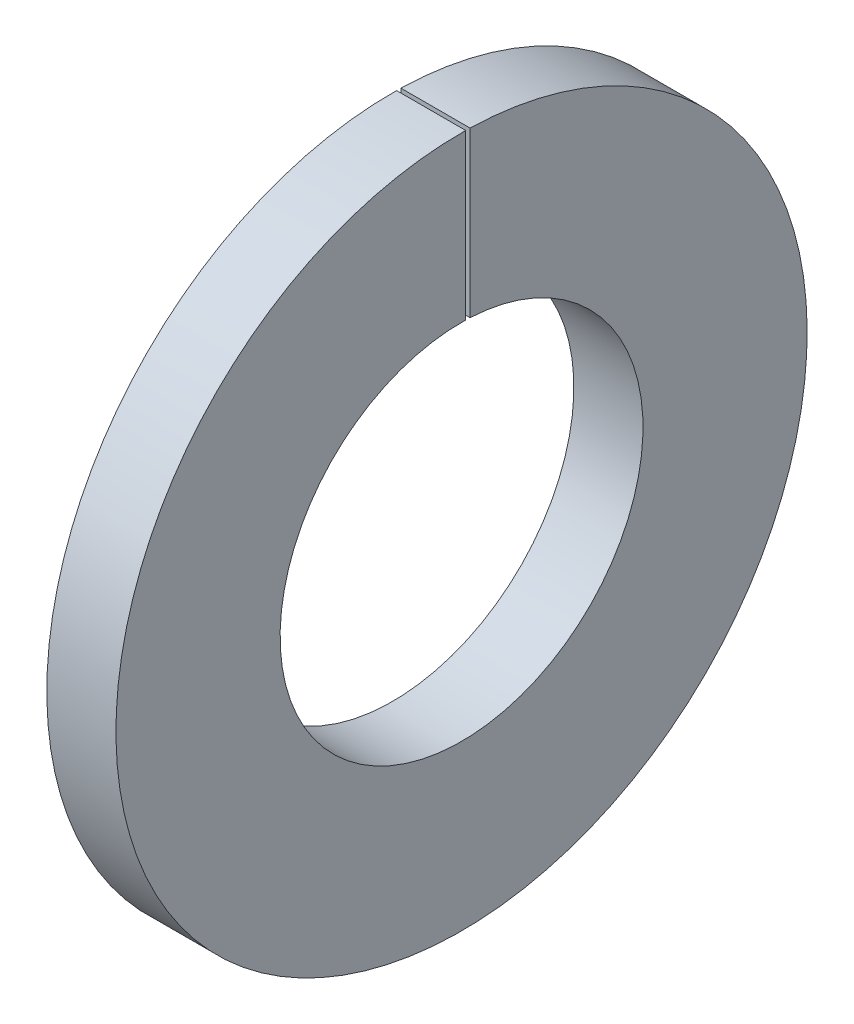
ISO-10303-21;
HEADER;
FILE_DESCRIPTION(('STEP AP214'),'2;1');
FILE_NAME('part.step','',(''),(''),'','','');
FILE_SCHEMA(('AUTOMOTIVE_DESIGN { 1 0 10303 214 1 1 1 1 }'));
ENDSEC;
DATA;
#1=APPLICATION_CONTEXT('core data for automotive mechanical design processes');
#2=APPLICATION_PROTOCOL_DEFINITION('international standard','automotive_design',2000,#1);
#3=PRODUCT_CONTEXT('',#1,'mechanical');
#4=PRODUCT('Part','Part','',(#3));
#5=PRODUCT_RELATED_PRODUCT_CATEGORY('part','',(#4));
#6=PRODUCT_DEFINITION_FORMATION('','',#4);
#7=PRODUCT_DEFINITION_CONTEXT('part definition',#1,'design');
#8=PRODUCT_DEFINITION('design','',#6,#7);
#9=PRODUCT_DEFINITION_SHAPE('','',#8);
#10=(LENGTH_UNIT() NAMED_UNIT(*) SI_UNIT(.MILLI.,.METRE.));
#11=(NAMED_UNIT(*) PLANE_ANGLE_UNIT() SI_UNIT($,.RADIAN.));
#12=(NAMED_UNIT(*) SI_UNIT($,.STERADIAN.) SOLID_ANGLE_UNIT());
#13=UNCERTAINTY_MEASURE_WITH_UNIT(LENGTH_MEASURE(1.E-05),#10,'distance_accuracy_value','');
#14=(GEOMETRIC_REPRESENTATION_CONTEXT(3) GLOBAL_UNCERTAINTY_ASSIGNED_CONTEXT((#13)) GLOBAL_UNIT_ASSIGNED_CONTEXT((#10,
#11,#12)) REPRESENTATION_CONTEXT('',''));
#15=CARTESIAN_POINT('',(0.,0.,0.));
#16=DIRECTION('',(0.,0.,1.));
#17=DIRECTION('',(1.,0.,0.));
#18=AXIS2_PLACEMENT_3D('',#15,#16,#17);
#19=CARTESIAN_POINT('',(-1.6,8.,0.));
#20=DIRECTION('',(1.,0.,0.));
#21=DIRECTION('',(0.,0.,-1.));
#22=AXIS2_PLACEMENT_3D('',#19,#20,#21);
#23=PLANE('',#22);
#24=CARTESIAN_POINT('',(-1.6,0.,0.));
#25=DIRECTION('',(-1.,0.,0.));
#26=DIRECTION('',(0.,0.,1.));
#27=AXIS2_PLACEMENT_3D('',#24,#25,#26);
#28=CIRCLE('',#27,8.);
#29=CARTESIAN_POINT('',(-1.6,7.99941769969397,-0.0965218411698541));
#30=VERTEX_POINT('',#29);
#31=CARTESIAN_POINT('',(-1.6,7.99758583360899,-0.196521841169854));
#32=VERTEX_POINT('',#31);
#33=EDGE_CURVE('E95',#30,#32,#28,.F.);
#34=ORIENTED_EDGE('',*,*,#33,.F.);
#35=DIRECTION('',(0.,-1.,0.));
#36=VECTOR('',#35,1.);
#37=CARTESIAN_POINT('',(-1.6,2.37523469246345,-0.0965218411698541));
#38=LINE('',#37,#36);
#39=CARTESIAN_POINT('',(-1.6,4.19889075044555,-0.0965218411698541));
#40=VERTEX_POINT('',#39);
#41=EDGE_CURVE('E112',#30,#40,#38,.T.);
#42=ORIENTED_EDGE('',*,*,#41,.T.);
#43=CARTESIAN_POINT('',(-1.6,0.,0.));
#44=DIRECTION('',(-1.,0.,0.));
#45=DIRECTION('',(0.,0.,1.));
#46=AXIS2_PLACEMENT_3D('',#43,#44,#45);
#47=CIRCLE('',#46,4.2);
#48=CARTESIAN_POINT('',(-1.6,4.195399762352,-0.196521841169854));
#49=VERTEX_POINT('',#48);
#50=EDGE_CURVE('E99',#40,#49,#47,.F.);
#51=ORIENTED_EDGE('',*,*,#50,.T.);
#52=DIRECTION('',(0.,1.,0.));
#53=VECTOR('',#52,1.);
#54=CARTESIAN_POINT('',(-1.6,2.37523469246345,-0.196521841169854));
#55=LINE('',#54,#53);
#56=EDGE_CURVE('E110',#49,#32,#55,.T.);
#57=ORIENTED_EDGE('',*,*,#56,.T.);
#58=EDGE_LOOP('',(#34,#42,#51,#57));
#59=FACE_BOUND('',#58,.T.);
#60=ADVANCED_FACE('F44',(#59),#23,.F.);
#61=CARTESIAN_POINT('',(-34.9249999999999,0.,0.));
#62=DIRECTION('',(-1.,0.,0.));
#63=DIRECTION('',(0.,0.,1.));
#64=AXIS2_PLACEMENT_3D('',#61,#62,#63);
#65=CYLINDRICAL_SURFACE('',#64,8.);
#66=DIRECTION('',(-1.,0.,0.));
#67=VECTOR('',#66,1.);
#68=CARTESIAN_POINT('',(-34.9249999999999,7.99941769969397,-0.0965218411698541));
#69=LINE('',#68,#67);
#70=CARTESIAN_POINT('',(0.,7.99941769969397,-0.0965218411698541));
#71=VERTEX_POINT('',#70);
#72=EDGE_CURVE('E58',#30,#71,#69,.F.);
#73=ORIENTED_EDGE('',*,*,#72,.F.);
#74=ORIENTED_EDGE('',*,*,#33,.T.);
#75=DIRECTION('',(-1.,0.,0.));
#76=VECTOR('',#75,1.);
#77=CARTESIAN_POINT('',(-34.9249999999999,7.99758583360899,-0.196521841169854));
#78=LINE('',#77,#76);
#79=CARTESIAN_POINT('',(0.,7.99758583360899,-0.196521841169854));
#80=VERTEX_POINT('',#79);
#81=EDGE_CURVE('E82',#80,#32,#78,.T.);
#82=ORIENTED_EDGE('',*,*,#81,.F.);
#83=CARTESIAN_POINT('',(0.,0.,0.));
#84=DIRECTION('',(-1.,0.,0.));
#85=DIRECTION('',(0.,0.,1.));
#86=AXIS2_PLACEMENT_3D('',#83,#84,#85);
#87=CIRCLE('',#86,8.);
#88=EDGE_CURVE('E93',#80,#71,#87,.T.);
#89=ORIENTED_EDGE('',*,*,#88,.T.);
#90=EDGE_LOOP('',(#73,#74,#82,#89));
#91=FACE_BOUND('',#90,.T.);
#92=ADVANCED_FACE('F92',(#91),#65,.T.);
#93=CARTESIAN_POINT('',(-34.9249999999999,0.,0.));
#94=DIRECTION('',(-1.,0.,0.));
#95=DIRECTION('',(0.,0.,1.));
#96=AXIS2_PLACEMENT_3D('',#93,#94,#95);
#97=CYLINDRICAL_SURFACE('',#96,4.2);
#98=ORIENTED_EDGE('',*,*,#50,.F.);
#99=DIRECTION('',(-1.,0.,0.));
#100=VECTOR('',#99,1.);
#101=CARTESIAN_POINT('',(-34.9249999999999,4.19889075044555,-0.0965218411698541));
#102=LINE('',#101,#100);
#103=CARTESIAN_POINT('',(0.,4.19889075044555,-0.0965218411698541));
#104=VERTEX_POINT('',#103);
#105=EDGE_CURVE('E96',#40,#104,#102,.F.);
#106=ORIENTED_EDGE('',*,*,#105,.T.);
#107=CARTESIAN_POINT('',(0.,0.,0.));
#108=DIRECTION('',(-1.,0.,0.));
#109=DIRECTION('',(0.,0.,1.));
#110=AXIS2_PLACEMENT_3D('',#107,#108,#109);
#111=CIRCLE('',#110,4.2);
#112=CARTESIAN_POINT('',(0.,4.195399762352,-0.196521841169854));
#113=VERTEX_POINT('',#112);
#114=EDGE_CURVE('E88',#104,#113,#111,.F.);
#115=ORIENTED_EDGE('',*,*,#114,.T.);
#116=DIRECTION('',(-1.,0.,0.));
#117=VECTOR('',#116,1.);
#118=CARTESIAN_POINT('',(-34.9249999999999,4.195399762352,-0.196521841169854));
#119=LINE('',#118,#117);
#120=EDGE_CURVE('E65',#113,#49,#119,.T.);
#121=ORIENTED_EDGE('',*,*,#120,.T.);
#122=EDGE_LOOP('',(#98,#106,#115,#121));
#123=FACE_BOUND('',#122,.T.);
#124=ADVANCED_FACE('F117',(#123),#97,.F.);
#125=CARTESIAN_POINT('',(0.,4.2,0.));
#126=DIRECTION('',(-1.,0.,0.));
#127=DIRECTION('',(0.,0.,1.));
#128=AXIS2_PLACEMENT_3D('',#125,#126,#127);
#129=PLANE('',#128);
#130=ORIENTED_EDGE('',*,*,#114,.F.);
#131=DIRECTION('',(0.,1.,0.));
#132=VECTOR('',#131,1.);
#133=CARTESIAN_POINT('',(0.,4.2,-0.0965218411698541));
#134=LINE('',#133,#132);
#135=EDGE_CURVE('E11',#104,#71,#134,.T.);
#136=ORIENTED_EDGE('',*,*,#135,.T.);
#137=ORIENTED_EDGE('',*,*,#88,.F.);
#138=DIRECTION('',(0.,-1.,0.));
#139=VECTOR('',#138,1.);
#140=CARTESIAN_POINT('',(0.,4.2,-0.196521841169854));
#141=LINE('',#140,#139);
#142=EDGE_CURVE('E51',#80,#113,#141,.T.);
#143=ORIENTED_EDGE('',*,*,#142,.T.);
#144=EDGE_LOOP('',(#130,#136,#137,#143));
#145=FACE_BOUND('',#144,.T.);
#146=ADVANCED_FACE('F98',(#145),#129,.F.);
#147=CARTESIAN_POINT('',(-1.6,2.37523469246345,-0.196521841169854));
#148=DIRECTION('',(0.,0.,-1.));
#149=DIRECTION('',(-1.,0.,0.));
#150=AXIS2_PLACEMENT_3D('',#147,#148,#149);
#151=PLANE('',#150);
#152=ORIENTED_EDGE('',*,*,#81,.T.);
#153=ORIENTED_EDGE('',*,*,#56,.F.);
#154=ORIENTED_EDGE('',*,*,#120,.F.);
#155=ORIENTED_EDGE('',*,*,#142,.F.);
#156=EDGE_LOOP('',(#152,#153,#154,#155));
#157=FACE_BOUND('',#156,.T.);
#158=ADVANCED_FACE('F81',(#157),#151,.F.);
#159=CARTESIAN_POINT('',(-1.6,2.37523469246345,-0.0965218411698541));
#160=DIRECTION('',(0.,0.,1.));
#161=DIRECTION('',(0.,-1.,0.));
#162=AXIS2_PLACEMENT_3D('',#159,#160,#161);
#163=PLANE('',#162);
#164=ORIENTED_EDGE('',*,*,#72,.T.);
#165=ORIENTED_EDGE('',*,*,#135,.F.);
#166=ORIENTED_EDGE('',*,*,#105,.F.);
#167=ORIENTED_EDGE('',*,*,#41,.F.);
#168=EDGE_LOOP('',(#164,#165,#166,#167));
#169=FACE_BOUND('',#168,.T.);
#170=ADVANCED_FACE('F118',(#169),#163,.F.);
#171=CLOSED_SHELL('',(#60,#92,#124,#146,#158,#170));
#172=MANIFOLD_SOLID_BREP('B2',#171);
#173=ADVANCED_BREP_SHAPE_REPRESENTATION('',(#18,#172),#14);
#174=SHAPE_DEFINITION_REPRESENTATION(#9,#173);
ENDSEC;
END-ISO-10303-21;
